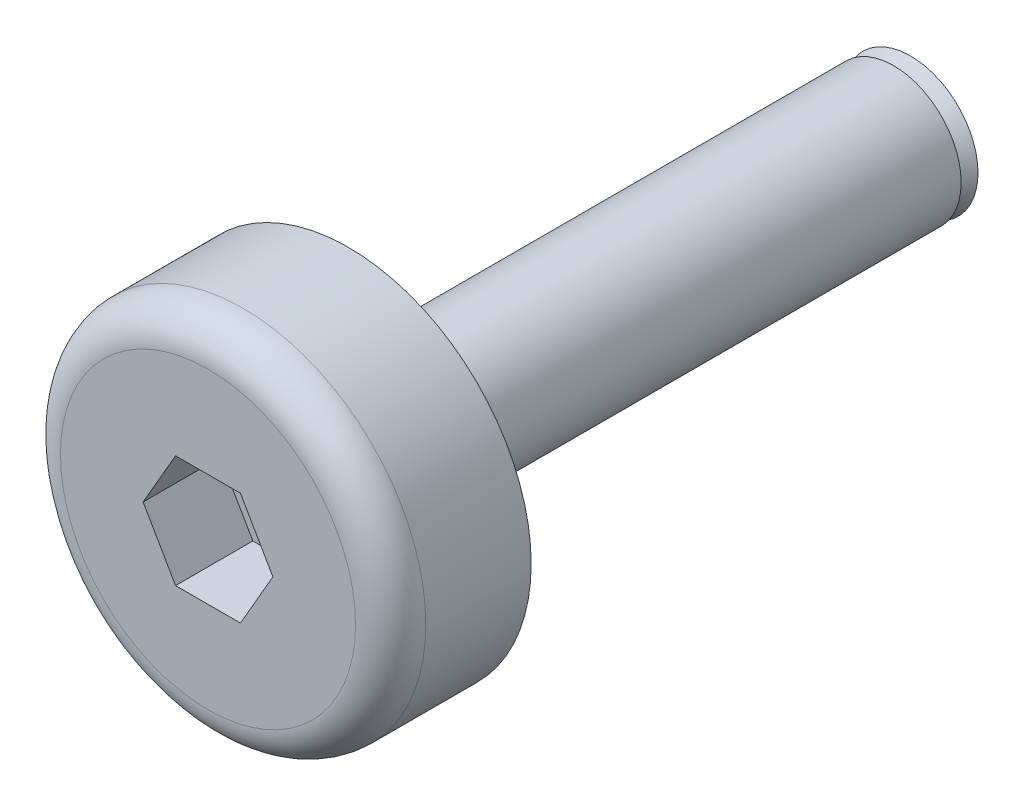
ISO-10303-21;
HEADER;
FILE_DESCRIPTION(('STEP AP214'),'2;1');
FILE_NAME('part.step','',(''),(''),'','','');
FILE_SCHEMA(('AUTOMOTIVE_DESIGN { 1 0 10303 214 1 1 1 1 }'));
ENDSEC;
DATA;
#1=APPLICATION_CONTEXT('core data for automotive mechanical design processes');
#2=APPLICATION_PROTOCOL_DEFINITION('international standard','automotive_design',2000,#1);
#3=PRODUCT_CONTEXT('',#1,'mechanical');
#4=PRODUCT('Part','Part','',(#3));
#5=PRODUCT_RELATED_PRODUCT_CATEGORY('part','',(#4));
#6=PRODUCT_DEFINITION_FORMATION('','',#4);
#7=PRODUCT_DEFINITION_CONTEXT('part definition',#1,'design');
#8=PRODUCT_DEFINITION('design','',#6,#7);
#9=PRODUCT_DEFINITION_SHAPE('','',#8);
#10=(LENGTH_UNIT() NAMED_UNIT(*) SI_UNIT(.MILLI.,.METRE.));
#11=(NAMED_UNIT(*) PLANE_ANGLE_UNIT() SI_UNIT($,.RADIAN.));
#12=(NAMED_UNIT(*) SI_UNIT($,.STERADIAN.) SOLID_ANGLE_UNIT());
#13=UNCERTAINTY_MEASURE_WITH_UNIT(LENGTH_MEASURE(1.E-05),#10,'distance_accuracy_value','');
#14=(GEOMETRIC_REPRESENTATION_CONTEXT(3) GLOBAL_UNCERTAINTY_ASSIGNED_CONTEXT((#13)) GLOBAL_UNIT_ASSIGNED_CONTEXT((#10,
#11,#12)) REPRESENTATION_CONTEXT('',''));
#15=CARTESIAN_POINT('',(0.,0.,0.));
#16=DIRECTION('',(0.,0.,1.));
#17=DIRECTION('',(1.,0.,0.));
#18=AXIS2_PLACEMENT_3D('',#15,#16,#17);
#19=CARTESIAN_POINT('',(0.,0.,-10.));
#20=DIRECTION('',(0.,0.,1.));
#21=DIRECTION('',(1.,0.,0.));
#22=AXIS2_PLACEMENT_3D('',#19,#20,#21);
#23=PLANE('',#22);
#24=CARTESIAN_POINT('',(0.,0.,-10.));
#25=DIRECTION('',(0.,0.,1.));
#26=DIRECTION('',(1.,0.,0.));
#27=AXIS2_PLACEMENT_3D('',#24,#25,#26);
#28=CIRCLE('',#27,1.2);
#29=CARTESIAN_POINT('',(1.2,0.,-10.));
#30=VERTEX_POINT('',#29);
#31=EDGE_CURVE('E9',#30,#30,#28,.T.);
#32=ORIENTED_EDGE('',*,*,#31,.F.);
#33=EDGE_LOOP('',(#32));
#34=FACE_BOUND('',#33,.T.);
#35=ADVANCED_FACE('F14',(#34),#23,.F.);
#36=CARTESIAN_POINT('',(0.,0.,-10.));
#37=DIRECTION('',(0.,0.,-1.));
#38=DIRECTION('',(1.,0.,0.));
#39=AXIS2_PLACEMENT_3D('',#36,#37,#38);
#40=CONICAL_SURFACE('',#39,1.2,0.785398163397);
#41=CARTESIAN_POINT('',(0.,0.,-9.7));
#42=DIRECTION('',(0.,0.,1.));
#43=DIRECTION('',(1.,0.,0.));
#44=AXIS2_PLACEMENT_3D('',#41,#42,#43);
#45=CIRCLE('',#44,0.9);
#46=CARTESIAN_POINT('',(0.9,0.,-9.7));
#47=VERTEX_POINT('',#46);
#48=EDGE_CURVE('E150',#47,#47,#45,.T.);
#49=ORIENTED_EDGE('',*,*,#48,.F.);
#50=DIRECTION('',(-0.707106781186548,0.,0.707106781186548));
#51=VECTOR('',#50,1.);
#52=CARTESIAN_POINT('',(1.2,0.,-10.));
#53=LINE('',#52,#51);
#54=EDGE_CURVE('E25',#30,#47,#53,.T.);
#55=ORIENTED_EDGE('',*,*,#54,.F.);
#56=ORIENTED_EDGE('',*,*,#31,.T.);
#57=ORIENTED_EDGE('',*,*,#54,.T.);
#58=EDGE_LOOP('',(#49,#55,#56,#57));
#59=FACE_BOUND('',#58,.T.);
#60=ADVANCED_FACE('F237',(#59),#40,.T.);
#61=CARTESIAN_POINT('',(0.,0.,1.125));
#62=DIRECTION('',(0.,0.,1.));
#63=DIRECTION('',(1.,0.,0.));
#64=AXIS2_PLACEMENT_3D('',#61,#62,#63);
#65=PLANE('',#64);
#66=DIRECTION('',(-0.50000000000019,0.866025403784329,0.));
#67=VECTOR('',#66,1.);
#68=CARTESIAN_POINT('',(1.154700538379,0.,1.125));
#69=LINE('',#68,#67);
#70=CARTESIAN_POINT('',(1.154700538379,0.,1.125));
#71=VERTEX_POINT('',#70);
#72=CARTESIAN_POINT('',(0.57735026919,1.,1.125));
#73=VERTEX_POINT('',#72);
#74=EDGE_CURVE('E174',#71,#73,#69,.T.);
#75=ORIENTED_EDGE('',*,*,#74,.T.);
#76=DIRECTION('',(-1.,0.,0.));
#77=VECTOR('',#76,1.);
#78=CARTESIAN_POINT('',(0.57735026919,1.,1.125));
#79=LINE('',#78,#77);
#80=CARTESIAN_POINT('',(-0.57735026919,1.,1.125));
#81=VERTEX_POINT('',#80);
#82=EDGE_CURVE('E155',#73,#81,#79,.T.);
#83=ORIENTED_EDGE('',*,*,#82,.T.);
#84=DIRECTION('',(-0.50000000000019,-0.866025403784329,0.));
#85=VECTOR('',#84,1.);
#86=CARTESIAN_POINT('',(-0.57735026919,1.,1.125));
#87=LINE('',#86,#85);
#88=CARTESIAN_POINT('',(-1.154700538379,0.,1.125));
#89=VERTEX_POINT('',#88);
#90=EDGE_CURVE('E165',#81,#89,#87,.T.);
#91=ORIENTED_EDGE('',*,*,#90,.T.);
#92=DIRECTION('',(0.50000000000019,-0.866025403784329,0.));
#93=VECTOR('',#92,1.);
#94=CARTESIAN_POINT('',(-1.154700538379,0.,1.125));
#95=LINE('',#94,#93);
#96=CARTESIAN_POINT('',(-0.57735026919,-1.,1.125));
#97=VERTEX_POINT('',#96);
#98=EDGE_CURVE('E118',#89,#97,#95,.T.);
#99=ORIENTED_EDGE('',*,*,#98,.T.);
#100=DIRECTION('',(1.,0.,0.));
#101=VECTOR('',#100,1.);
#102=CARTESIAN_POINT('',(-0.57735026919,-1.,1.125));
#103=LINE('',#102,#101);
#104=CARTESIAN_POINT('',(0.57735026919,-1.,1.125));
#105=VERTEX_POINT('',#104);
#106=EDGE_CURVE('E114',#97,#105,#103,.T.);
#107=ORIENTED_EDGE('',*,*,#106,.T.);
#108=DIRECTION('',(0.50000000000019,0.866025403784329,0.));
#109=VECTOR('',#108,1.);
#110=CARTESIAN_POINT('',(0.57735026919,-1.,1.125));
#111=LINE('',#110,#109);
#112=EDGE_CURVE('E147',#105,#71,#111,.T.);
#113=ORIENTED_EDGE('',*,*,#112,.T.);
#114=EDGE_LOOP('',(#75,#83,#91,#99,#107,#113));
#115=FACE_BOUND('',#114,.T.);
#116=ADVANCED_FACE('F243',(#115),#65,.T.);
#117=CARTESIAN_POINT('',(0.,0.,-9.7));
#118=DIRECTION('',(0.,0.,1.));
#119=DIRECTION('',(1.,0.,0.));
#120=AXIS2_PLACEMENT_3D('',#117,#118,#119);
#121=PLANE('',#120);
#122=ORIENTED_EDGE('',*,*,#48,.T.);
#123=EDGE_LOOP('',(#122));
#124=FACE_BOUND('',#123,.T.);
#125=CARTESIAN_POINT('',(0.,0.,-9.7));
#126=DIRECTION('',(0.,0.,1.));
#127=DIRECTION('',(1.,0.,0.));
#128=AXIS2_PLACEMENT_3D('',#125,#126,#127);
#129=CIRCLE('',#128,1.2);
#130=CARTESIAN_POINT('',(1.2,0.,-9.7));
#131=VERTEX_POINT('',#130);
#132=EDGE_CURVE('E162',#131,#131,#129,.T.);
#133=ORIENTED_EDGE('',*,*,#132,.F.);
#134=EDGE_LOOP('',(#133));
#135=FACE_BOUND('',#134,.T.);
#136=ADVANCED_FACE('F233',(#124,#135),#121,.F.);
#137=CARTESIAN_POINT('',(1.154700538379,0.,1.125));
#138=DIRECTION('',(-0.866025403784329,-0.50000000000019,0.));
#139=DIRECTION('',(-0.50000000000019,0.866025403784329,0.));
#140=AXIS2_PLACEMENT_3D('',#137,#138,#139);
#141=PLANE('',#140);
#142=ORIENTED_EDGE('',*,*,#74,.F.);
#143=DIRECTION('',(0.,0.,1.));
#144=VECTOR('',#143,1.);
#145=CARTESIAN_POINT('',(1.154700538379,0.,1.125));
#146=LINE('',#145,#144);
#147=CARTESIAN_POINT('',(1.154700538379,0.,2.5));
#148=VERTEX_POINT('',#147);
#149=EDGE_CURVE('E172',#71,#148,#146,.T.);
#150=ORIENTED_EDGE('',*,*,#149,.T.);
#151=DIRECTION('',(0.50000000000019,-0.866025403784329,0.));
#152=VECTOR('',#151,1.);
#153=CARTESIAN_POINT('',(1.010362971082,0.25,2.5));
#154=LINE('',#153,#152);
#155=CARTESIAN_POINT('',(0.57735026919,1.,2.5));
#156=VERTEX_POINT('',#155);
#157=EDGE_CURVE('E140',#156,#148,#154,.T.);
#158=ORIENTED_EDGE('',*,*,#157,.F.);
#159=DIRECTION('',(0.,0.,1.));
#160=VECTOR('',#159,1.);
#161=CARTESIAN_POINT('',(0.57735026919,1.,1.125));
#162=LINE('',#161,#160);
#163=EDGE_CURVE('E151',#73,#156,#162,.T.);
#164=ORIENTED_EDGE('',*,*,#163,.F.);
#165=EDGE_LOOP('',(#142,#150,#158,#164));
#166=FACE_BOUND('',#165,.T.);
#167=ADVANCED_FACE('F222',(#166),#141,.T.);
#168=CARTESIAN_POINT('',(0.57735026919,-1.,1.125));
#169=DIRECTION('',(-0.866025403784329,0.50000000000019,0.));
#170=DIRECTION('',(0.,0.,1.));
#171=AXIS2_PLACEMENT_3D('',#168,#169,#170);
#172=PLANE('',#171);
#173=ORIENTED_EDGE('',*,*,#112,.F.);
#174=DIRECTION('',(0.,0.,1.));
#175=VECTOR('',#174,1.);
#176=CARTESIAN_POINT('',(0.57735026919,-1.,1.125));
#177=LINE('',#176,#175);
#178=CARTESIAN_POINT('',(0.57735026919,-1.,2.5));
#179=VERTEX_POINT('',#178);
#180=EDGE_CURVE('E100',#105,#179,#177,.T.);
#181=ORIENTED_EDGE('',*,*,#180,.T.);
#182=DIRECTION('',(-0.50000000000019,-0.866025403784329,0.));
#183=VECTOR('',#182,1.);
#184=CARTESIAN_POINT('',(0.721687836487,-0.75,2.5));
#185=LINE('',#184,#183);
#186=EDGE_CURVE('E133',#148,#179,#185,.T.);
#187=ORIENTED_EDGE('',*,*,#186,.F.);
#188=ORIENTED_EDGE('',*,*,#149,.F.);
#189=EDGE_LOOP('',(#173,#181,#187,#188));
#190=FACE_BOUND('',#189,.T.);
#191=ADVANCED_FACE('F224',(#190),#172,.T.);
#192=CARTESIAN_POINT('',(-0.57735026919,-1.,1.125));
#193=DIRECTION('',(0.,1.,0.));
#194=DIRECTION('',(1.,0.,0.));
#195=AXIS2_PLACEMENT_3D('',#192,#193,#194);
#196=PLANE('',#195);
#197=ORIENTED_EDGE('',*,*,#106,.F.);
#198=DIRECTION('',(0.,0.,1.));
#199=VECTOR('',#198,1.);
#200=CARTESIAN_POINT('',(-0.57735026919,-1.,1.125));
#201=LINE('',#200,#199);
#202=CARTESIAN_POINT('',(-0.57735026919,-1.,2.5));
#203=VERTEX_POINT('',#202);
#204=EDGE_CURVE('E107',#97,#203,#201,.T.);
#205=ORIENTED_EDGE('',*,*,#204,.T.);
#206=DIRECTION('',(-1.,0.,0.));
#207=VECTOR('',#206,1.);
#208=CARTESIAN_POINT('',(-0.288675134595,-1.,2.5));
#209=LINE('',#208,#207);
#210=EDGE_CURVE('E111',#179,#203,#209,.T.);
#211=ORIENTED_EDGE('',*,*,#210,.F.);
#212=ORIENTED_EDGE('',*,*,#180,.F.);
#213=EDGE_LOOP('',(#197,#205,#211,#212));
#214=FACE_BOUND('',#213,.T.);
#215=ADVANCED_FACE('F109',(#214),#196,.T.);
#216=CARTESIAN_POINT('',(-1.154700538379,0.,1.125));
#217=DIRECTION('',(0.866025403784329,0.50000000000019,0.));
#218=DIRECTION('',(0.,0.,-1.));
#219=AXIS2_PLACEMENT_3D('',#216,#217,#218);
#220=PLANE('',#219);
#221=ORIENTED_EDGE('',*,*,#98,.F.);
#222=DIRECTION('',(0.,0.,1.));
#223=VECTOR('',#222,1.);
#224=CARTESIAN_POINT('',(-1.154700538379,0.,1.125));
#225=LINE('',#224,#223);
#226=CARTESIAN_POINT('',(-1.154700538379,0.,2.5));
#227=VERTEX_POINT('',#226);
#228=EDGE_CURVE('E18',#89,#227,#225,.T.);
#229=ORIENTED_EDGE('',*,*,#228,.T.);
#230=DIRECTION('',(-0.50000000000019,0.866025403784329,0.));
#231=VECTOR('',#230,1.);
#232=CARTESIAN_POINT('',(-1.010362971082,-0.25,2.5));
#233=LINE('',#232,#231);
#234=EDGE_CURVE('E121',#203,#227,#233,.T.);
#235=ORIENTED_EDGE('',*,*,#234,.F.);
#236=ORIENTED_EDGE('',*,*,#204,.F.);
#237=EDGE_LOOP('',(#221,#229,#235,#236));
#238=FACE_BOUND('',#237,.T.);
#239=ADVANCED_FACE('F16',(#238),#220,.T.);
#240=CARTESIAN_POINT('',(-0.57735026919,1.,1.125));
#241=DIRECTION('',(0.866025403784329,-0.50000000000019,0.));
#242=DIRECTION('',(0.,0.,-1.));
#243=AXIS2_PLACEMENT_3D('',#240,#241,#242);
#244=PLANE('',#243);
#245=ORIENTED_EDGE('',*,*,#90,.F.);
#246=DIRECTION('',(0.,0.,1.));
#247=VECTOR('',#246,1.);
#248=CARTESIAN_POINT('',(-0.57735026919,1.,1.125));
#249=LINE('',#248,#247);
#250=CARTESIAN_POINT('',(-0.57735026919,1.,2.5));
#251=VERTEX_POINT('',#250);
#252=EDGE_CURVE('E154',#81,#251,#249,.T.);
#253=ORIENTED_EDGE('',*,*,#252,.T.);
#254=DIRECTION('',(0.50000000000019,0.866025403784329,0.));
#255=VECTOR('',#254,1.);
#256=CARTESIAN_POINT('',(-0.721687836487,0.75,2.5));
#257=LINE('',#256,#255);
#258=EDGE_CURVE('E127',#227,#251,#257,.T.);
#259=ORIENTED_EDGE('',*,*,#258,.F.);
#260=ORIENTED_EDGE('',*,*,#228,.F.);
#261=EDGE_LOOP('',(#245,#253,#259,#260));
#262=FACE_BOUND('',#261,.T.);
#263=ADVANCED_FACE('F249',(#262),#244,.T.);
#264=CARTESIAN_POINT('',(0.57735026919,1.,1.125));
#265=DIRECTION('',(0.,-1.,0.));
#266=DIRECTION('',(-1.,0.,0.));
#267=AXIS2_PLACEMENT_3D('',#264,#265,#266);
#268=PLANE('',#267);
#269=ORIENTED_EDGE('',*,*,#82,.F.);
#270=ORIENTED_EDGE('',*,*,#163,.T.);
#271=DIRECTION('',(1.,0.,0.));
#272=VECTOR('',#271,1.);
#273=CARTESIAN_POINT('',(0.288675134595,1.,2.5));
#274=LINE('',#273,#272);
#275=EDGE_CURVE('E185',#251,#156,#274,.T.);
#276=ORIENTED_EDGE('',*,*,#275,.F.);
#277=ORIENTED_EDGE('',*,*,#252,.F.);
#278=EDGE_LOOP('',(#269,#270,#276,#277));
#279=FACE_BOUND('',#278,.T.);
#280=ADVANCED_FACE('F219',(#279),#268,.T.);
#281=CARTESIAN_POINT('',(0.,0.,-9.7));
#282=DIRECTION('',(0.,0.,1.));
#283=DIRECTION('',(1.,0.,0.));
#284=AXIS2_PLACEMENT_3D('',#281,#282,#283);
#285=CYLINDRICAL_SURFACE('',#284,1.2);
#286=CARTESIAN_POINT('',(0.,0.,0.));
#287=DIRECTION('',(0.,0.,1.));
#288=DIRECTION('',(1.,0.,0.));
#289=AXIS2_PLACEMENT_3D('',#286,#287,#288);
#290=CIRCLE('',#289,1.2);
#291=CARTESIAN_POINT('',(1.2,0.,0.));
#292=VERTEX_POINT('',#291);
#293=EDGE_CURVE('E181',#292,#292,#290,.T.);
#294=ORIENTED_EDGE('',*,*,#293,.F.);
#295=DIRECTION('',(0.,0.,1.));
#296=VECTOR('',#295,1.);
#297=CARTESIAN_POINT('',(1.2,0.,-9.7));
#298=LINE('',#297,#296);
#299=EDGE_CURVE('E158',#131,#292,#298,.T.);
#300=ORIENTED_EDGE('',*,*,#299,.F.);
#301=ORIENTED_EDGE('',*,*,#132,.T.);
#302=ORIENTED_EDGE('',*,*,#299,.T.);
#303=EDGE_LOOP('',(#294,#300,#301,#302));
#304=FACE_BOUND('',#303,.T.);
#305=ADVANCED_FACE('F248',(#304),#285,.T.);
#306=CARTESIAN_POINT('',(0.,0.,2.5));
#307=DIRECTION('',(0.,0.,1.));
#308=DIRECTION('',(1.,0.,0.));
#309=AXIS2_PLACEMENT_3D('',#306,#307,#308);
#310=PLANE('',#309);
#311=ORIENTED_EDGE('',*,*,#275,.T.);
#312=ORIENTED_EDGE('',*,*,#157,.T.);
#313=ORIENTED_EDGE('',*,*,#186,.T.);
#314=ORIENTED_EDGE('',*,*,#210,.T.);
#315=ORIENTED_EDGE('',*,*,#234,.T.);
#316=ORIENTED_EDGE('',*,*,#258,.T.);
#317=EDGE_LOOP('',(#311,#312,#313,#314,#315,#316));
#318=FACE_BOUND('',#317,.T.);
#319=CARTESIAN_POINT('',(0.,0.,2.5));
#320=DIRECTION('',(0.,0.,1.));
#321=DIRECTION('',(1.,0.,0.));
#322=AXIS2_PLACEMENT_3D('',#319,#320,#321);
#323=CIRCLE('',#322,2.625);
#324=CARTESIAN_POINT('',(2.625,0.,2.5));
#325=VERTEX_POINT('',#324);
#326=EDGE_CURVE('E179',#325,#325,#323,.T.);
#327=ORIENTED_EDGE('',*,*,#326,.T.);
#328=EDGE_LOOP('',(#327));
#329=FACE_BOUND('',#328,.T.);
#330=ADVANCED_FACE('F130',(#318,#329),#310,.T.);
#331=CARTESIAN_POINT('',(0.,0.,0.));
#332=DIRECTION('',(0.,0.,1.));
#333=DIRECTION('',(1.,0.,0.));
#334=AXIS2_PLACEMENT_3D('',#331,#332,#333);
#335=PLANE('',#334);
#336=ORIENTED_EDGE('',*,*,#293,.T.);
#337=EDGE_LOOP('',(#336));
#338=FACE_BOUND('',#337,.T.);
#339=CARTESIAN_POINT('',(0.,0.,0.));
#340=DIRECTION('',(0.,0.,1.));
#341=DIRECTION('',(1.,0.,0.));
#342=AXIS2_PLACEMENT_3D('',#339,#340,#341);
#343=CIRCLE('',#342,3.25);
#344=CARTESIAN_POINT('',(3.25,0.,0.));
#345=VERTEX_POINT('',#344);
#346=EDGE_CURVE('E144',#345,#345,#343,.T.);
#347=ORIENTED_EDGE('',*,*,#346,.F.);
#348=EDGE_LOOP('',(#347));
#349=FACE_BOUND('',#348,.T.);
#350=ADVANCED_FACE('F260',(#338,#349),#335,.F.);
#351=CARTESIAN_POINT('',(0.,0.,1.875));
#352=DIRECTION('',(0.,0.,1.));
#353=DIRECTION('',(1.,0.,0.));
#354=AXIS2_PLACEMENT_3D('',#351,#352,#353);
#355=TOROIDAL_SURFACE('',#354,2.625,0.625);
#356=CARTESIAN_POINT('',(2.625,0.,1.875));
#357=DIRECTION('',(0.,-1.,0.));
#358=DIRECTION('',(1.,0.,0.));
#359=AXIS2_PLACEMENT_3D('',#356,#357,#358);
#360=CIRCLE('',#359,0.625);
#361=CARTESIAN_POINT('',(3.25,0.,1.875));
#362=VERTEX_POINT('',#361);
#363=EDGE_CURVE('E176',#362,#325,#360,.T.);
#364=ORIENTED_EDGE('',*,*,#363,.F.);
#365=CARTESIAN_POINT('',(0.,0.,1.875));
#366=DIRECTION('',(0.,0.,1.));
#367=DIRECTION('',(1.,0.,0.));
#368=AXIS2_PLACEMENT_3D('',#365,#366,#367);
#369=CIRCLE('',#368,3.25);
#370=EDGE_CURVE('E188',#362,#362,#369,.T.);
#371=ORIENTED_EDGE('',*,*,#370,.T.);
#372=ORIENTED_EDGE('',*,*,#363,.T.);
#373=ORIENTED_EDGE('',*,*,#326,.F.);
#374=EDGE_LOOP('',(#364,#371,#372,#373));
#375=FACE_BOUND('',#374,.T.);
#376=ADVANCED_FACE('F257',(#375),#355,.T.);
#377=CARTESIAN_POINT('',(0.,0.,0.));
#378=DIRECTION('',(0.,0.,1.));
#379=DIRECTION('',(1.,0.,0.));
#380=AXIS2_PLACEMENT_3D('',#377,#378,#379);
#381=CYLINDRICAL_SURFACE('',#380,3.25);
#382=DIRECTION('',(0.,0.,1.));
#383=VECTOR('',#382,1.);
#384=CARTESIAN_POINT('',(3.25,0.,0.));
#385=LINE('',#384,#383);
#386=EDGE_CURVE('E192',#345,#362,#385,.T.);
#387=ORIENTED_EDGE('',*,*,#386,.T.);
#388=ORIENTED_EDGE('',*,*,#370,.F.);
#389=ORIENTED_EDGE('',*,*,#386,.F.);
#390=ORIENTED_EDGE('',*,*,#346,.T.);
#391=EDGE_LOOP('',(#387,#388,#389,#390));
#392=FACE_BOUND('',#391,.T.);
#393=ADVANCED_FACE('F254',(#392),#381,.T.);
#394=CLOSED_SHELL('',(#35,#60,#116,#136,#167,#191,#215,#239,#263,#280,#305,#330,#350,#376,#393));
#395=MANIFOLD_SOLID_BREP('B1',#394);
#396=ADVANCED_BREP_SHAPE_REPRESENTATION('',(#18,#395),#14);
#397=SHAPE_DEFINITION_REPRESENTATION(#9,#396);
ENDSEC;
END-ISO-10303-21;
